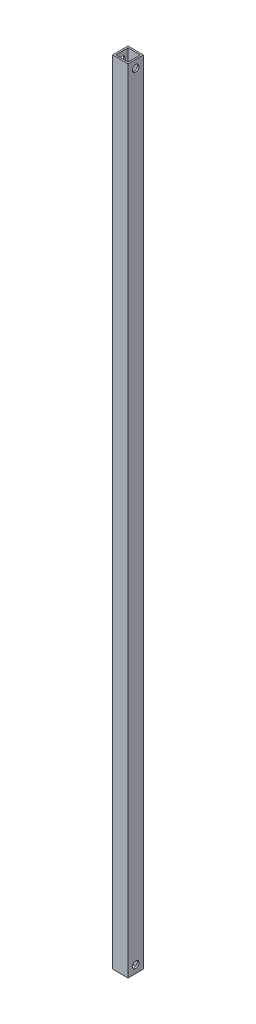
ISO-10303-21;
HEADER;
FILE_DESCRIPTION(('STEP AP214'),'2;1');
FILE_NAME('part.step','',(''),(''),'','','');
FILE_SCHEMA(('AUTOMOTIVE_DESIGN { 1 0 10303 214 1 1 1 1 }'));
ENDSEC;
DATA;
#1=APPLICATION_CONTEXT('core data for automotive mechanical design processes');
#2=APPLICATION_PROTOCOL_DEFINITION('international standard','automotive_design',2000,#1);
#3=PRODUCT_CONTEXT('',#1,'mechanical');
#4=PRODUCT('Part','Part','',(#3));
#5=PRODUCT_RELATED_PRODUCT_CATEGORY('part','',(#4));
#6=PRODUCT_DEFINITION_FORMATION('','',#4);
#7=PRODUCT_DEFINITION_CONTEXT('part definition',#1,'design');
#8=PRODUCT_DEFINITION('design','',#6,#7);
#9=PRODUCT_DEFINITION_SHAPE('','',#8);
#10=(LENGTH_UNIT() NAMED_UNIT(*) SI_UNIT(.MILLI.,.METRE.));
#11=(NAMED_UNIT(*) PLANE_ANGLE_UNIT() SI_UNIT($,.RADIAN.));
#12=(NAMED_UNIT(*) SI_UNIT($,.STERADIAN.) SOLID_ANGLE_UNIT());
#13=UNCERTAINTY_MEASURE_WITH_UNIT(LENGTH_MEASURE(1.E-05),#10,'distance_accuracy_value','');
#14=(GEOMETRIC_REPRESENTATION_CONTEXT(3) GLOBAL_UNCERTAINTY_ASSIGNED_CONTEXT((#13)) GLOBAL_UNIT_ASSIGNED_CONTEXT((#10,
#11,#12)) REPRESENTATION_CONTEXT('',''));
#15=CARTESIAN_POINT('',(0.,0.,0.));
#16=DIRECTION('',(0.,0.,1.));
#17=DIRECTION('',(1.,0.,0.));
#18=AXIS2_PLACEMENT_3D('',#15,#16,#17);
#19=CARTESIAN_POINT('',(0.,513.21590794,0.));
#20=DIRECTION('',(0.,1.,0.));
#21=DIRECTION('',(0.,0.,1.));
#22=AXIS2_PLACEMENT_3D('',#19,#20,#21);
#23=PLANE('',#22);
#24=DIRECTION('',(0.,0.,-1.));
#25=VECTOR('',#24,1.);
#26=CARTESIAN_POINT('',(5.,513.21590794,-5.));
#27=LINE('',#26,#25);
#28=CARTESIAN_POINT('',(5.,513.21590794,5.));
#29=VERTEX_POINT('',#28);
#30=CARTESIAN_POINT('',(5.,513.21590794,-5.));
#31=VERTEX_POINT('',#30);
#32=EDGE_CURVE('E168',#29,#31,#27,.T.);
#33=ORIENTED_EDGE('',*,*,#32,.T.);
#34=DIRECTION('',(-1.,0.,0.));
#35=VECTOR('',#34,1.);
#36=CARTESIAN_POINT('',(-5.,513.21590794,-5.));
#37=LINE('',#36,#35);
#38=CARTESIAN_POINT('',(-5.,513.21590794,-5.));
#39=VERTEX_POINT('',#38);
#40=EDGE_CURVE('E171',#31,#39,#37,.T.);
#41=ORIENTED_EDGE('',*,*,#40,.T.);
#42=DIRECTION('',(0.,0.,1.));
#43=VECTOR('',#42,1.);
#44=CARTESIAN_POINT('',(-5.,513.21590794,-5.));
#45=LINE('',#44,#43);
#46=CARTESIAN_POINT('',(-5.,513.21590794,5.));
#47=VERTEX_POINT('',#46);
#48=EDGE_CURVE('E174',#39,#47,#45,.T.);
#49=ORIENTED_EDGE('',*,*,#48,.T.);
#50=DIRECTION('',(1.,0.,0.));
#51=VECTOR('',#50,1.);
#52=CARTESIAN_POINT('',(-5.,513.21590794,5.));
#53=LINE('',#52,#51);
#54=EDGE_CURVE('E176',#47,#29,#53,.T.);
#55=ORIENTED_EDGE('',*,*,#54,.T.);
#56=EDGE_LOOP('',(#33,#41,#49,#55));
#57=FACE_BOUND('',#56,.T.);
#58=DIRECTION('',(-1.,0.,0.));
#59=VECTOR('',#58,1.);
#60=CARTESIAN_POINT('',(-5.,513.21590794,-4.));
#61=LINE('',#60,#59);
#62=CARTESIAN_POINT('',(4.,513.21590794,-4.));
#63=VERTEX_POINT('',#62);
#64=CARTESIAN_POINT('',(-4.,513.21590794,-4.));
#65=VERTEX_POINT('',#64);
#66=EDGE_CURVE('E138',#63,#65,#61,.T.);
#67=ORIENTED_EDGE('',*,*,#66,.F.);
#68=DIRECTION('',(0.,0.,-1.));
#69=VECTOR('',#68,1.);
#70=CARTESIAN_POINT('',(4.,513.21590794,-5.));
#71=LINE('',#70,#69);
#72=CARTESIAN_POINT('',(4.,513.21590794,4.));
#73=VERTEX_POINT('',#72);
#74=EDGE_CURVE('E130',#73,#63,#71,.T.);
#75=ORIENTED_EDGE('',*,*,#74,.F.);
#76=DIRECTION('',(1.,0.,0.));
#77=VECTOR('',#76,1.);
#78=CARTESIAN_POINT('',(-5.,513.21590794,4.));
#79=LINE('',#78,#77);
#80=CARTESIAN_POINT('',(-4.,513.21590794,4.));
#81=VERTEX_POINT('',#80);
#82=EDGE_CURVE('E152',#81,#73,#79,.T.);
#83=ORIENTED_EDGE('',*,*,#82,.F.);
#84=DIRECTION('',(0.,0.,1.));
#85=VECTOR('',#84,1.);
#86=CARTESIAN_POINT('',(-4.,513.21590794,-5.));
#87=LINE('',#86,#85);
#88=EDGE_CURVE('E150',#65,#81,#87,.T.);
#89=ORIENTED_EDGE('',*,*,#88,.F.);
#90=EDGE_LOOP('',(#67,#75,#83,#89));
#91=FACE_BOUND('',#90,.T.);
#92=ADVANCED_FACE('F63',(#57,#91),#23,.T.);
#93=CARTESIAN_POINT('',(0.,0.,0.));
#94=DIRECTION('',(0.,1.,0.));
#95=DIRECTION('',(0.,0.,1.));
#96=AXIS2_PLACEMENT_3D('',#93,#94,#95);
#97=PLANE('',#96);
#98=DIRECTION('',(0.,0.,-1.));
#99=VECTOR('',#98,1.);
#100=CARTESIAN_POINT('',(5.,0.,-5.));
#101=LINE('',#100,#99);
#102=CARTESIAN_POINT('',(5.,0.,5.));
#103=VERTEX_POINT('',#102);
#104=CARTESIAN_POINT('',(5.,0.,-5.));
#105=VERTEX_POINT('',#104);
#106=EDGE_CURVE('E146',#103,#105,#101,.T.);
#107=ORIENTED_EDGE('',*,*,#106,.F.);
#108=DIRECTION('',(1.,0.,0.));
#109=VECTOR('',#108,1.);
#110=CARTESIAN_POINT('',(-5.,0.,5.));
#111=LINE('',#110,#109);
#112=CARTESIAN_POINT('',(-5.,0.,5.));
#113=VERTEX_POINT('',#112);
#114=EDGE_CURVE('E172',#113,#103,#111,.T.);
#115=ORIENTED_EDGE('',*,*,#114,.F.);
#116=DIRECTION('',(0.,0.,1.));
#117=VECTOR('',#116,1.);
#118=CARTESIAN_POINT('',(-5.,0.,-5.));
#119=LINE('',#118,#117);
#120=CARTESIAN_POINT('',(-5.,0.,-5.));
#121=VERTEX_POINT('',#120);
#122=EDGE_CURVE('E183',#121,#113,#119,.T.);
#123=ORIENTED_EDGE('',*,*,#122,.F.);
#124=DIRECTION('',(-1.,0.,0.));
#125=VECTOR('',#124,1.);
#126=CARTESIAN_POINT('',(-5.,0.,-5.));
#127=LINE('',#126,#125);
#128=EDGE_CURVE('E181',#105,#121,#127,.T.);
#129=ORIENTED_EDGE('',*,*,#128,.F.);
#130=EDGE_LOOP('',(#107,#115,#123,#129));
#131=FACE_BOUND('',#130,.T.);
#132=DIRECTION('',(0.,0.,-1.));
#133=VECTOR('',#132,1.);
#134=CARTESIAN_POINT('',(4.,0.,-5.));
#135=LINE('',#134,#133);
#136=CARTESIAN_POINT('',(4.,0.,4.));
#137=VERTEX_POINT('',#136);
#138=CARTESIAN_POINT('',(4.,0.,-4.));
#139=VERTEX_POINT('',#138);
#140=EDGE_CURVE('E88',#137,#139,#135,.T.);
#141=ORIENTED_EDGE('',*,*,#140,.T.);
#142=DIRECTION('',(-1.,0.,0.));
#143=VECTOR('',#142,1.);
#144=CARTESIAN_POINT('',(-5.,0.,-4.));
#145=LINE('',#144,#143);
#146=CARTESIAN_POINT('',(-4.,0.,-4.));
#147=VERTEX_POINT('',#146);
#148=EDGE_CURVE('E145',#139,#147,#145,.T.);
#149=ORIENTED_EDGE('',*,*,#148,.T.);
#150=DIRECTION('',(0.,0.,1.));
#151=VECTOR('',#150,1.);
#152=CARTESIAN_POINT('',(-4.,0.,-5.));
#153=LINE('',#152,#151);
#154=CARTESIAN_POINT('',(-4.,0.,4.));
#155=VERTEX_POINT('',#154);
#156=EDGE_CURVE('E160',#147,#155,#153,.T.);
#157=ORIENTED_EDGE('',*,*,#156,.T.);
#158=DIRECTION('',(1.,0.,0.));
#159=VECTOR('',#158,1.);
#160=CARTESIAN_POINT('',(-5.,0.,4.));
#161=LINE('',#160,#159);
#162=EDGE_CURVE('E139',#155,#137,#161,.T.);
#163=ORIENTED_EDGE('',*,*,#162,.T.);
#164=EDGE_LOOP('',(#141,#149,#157,#163));
#165=FACE_BOUND('',#164,.T.);
#166=ADVANCED_FACE('F238',(#131,#165),#97,.F.);
#167=CARTESIAN_POINT('',(5.,513.21590794,-5.));
#168=DIRECTION('',(-1.,0.,0.));
#169=DIRECTION('',(0.,0.,1.));
#170=AXIS2_PLACEMENT_3D('',#167,#168,#169);
#171=PLANE('',#170);
#172=CARTESIAN_POINT('',(5.,508.21590794,0.));
#173=DIRECTION('',(-1.,0.,0.));
#174=DIRECTION('',(0.,0.,1.));
#175=AXIS2_PLACEMENT_3D('',#172,#173,#174);
#176=CIRCLE('',#175,2.15000000000003);
#177=CARTESIAN_POINT('',(5.,508.21590794,2.15000000000003));
#178=VERTEX_POINT('',#177);
#179=EDGE_CURVE('E201',#178,#178,#176,.T.);
#180=ORIENTED_EDGE('',*,*,#179,.T.);
#181=EDGE_LOOP('',(#180));
#182=FACE_BOUND('',#181,.T.);
#183=CARTESIAN_POINT('',(5.,5.,0.));
#184=DIRECTION('',(-1.,0.,0.));
#185=DIRECTION('',(0.,0.,-1.));
#186=AXIS2_PLACEMENT_3D('',#183,#184,#185);
#187=CIRCLE('',#186,2.15000000000003);
#188=CARTESIAN_POINT('',(5.,5.,-2.15000000000003));
#189=VERTEX_POINT('',#188);
#190=EDGE_CURVE('E211',#189,#189,#187,.T.);
#191=ORIENTED_EDGE('',*,*,#190,.T.);
#192=EDGE_LOOP('',(#191));
#193=FACE_BOUND('',#192,.T.);
#194=ORIENTED_EDGE('',*,*,#106,.T.);
#195=DIRECTION('',(0.,-1.,0.));
#196=VECTOR('',#195,1.);
#197=CARTESIAN_POINT('',(5.,513.21590794,-5.));
#198=LINE('',#197,#196);
#199=EDGE_CURVE('E12',#31,#105,#198,.T.);
#200=ORIENTED_EDGE('',*,*,#199,.F.);
#201=ORIENTED_EDGE('',*,*,#32,.F.);
#202=DIRECTION('',(0.,-1.,0.));
#203=VECTOR('',#202,1.);
#204=CARTESIAN_POINT('',(5.,513.21590794,5.));
#205=LINE('',#204,#203);
#206=EDGE_CURVE('E178',#29,#103,#205,.T.);
#207=ORIENTED_EDGE('',*,*,#206,.T.);
#208=EDGE_LOOP('',(#194,#200,#201,#207));
#209=FACE_BOUND('',#208,.T.);
#210=ADVANCED_FACE('F65',(#182,#193,#209),#171,.F.);
#211=CARTESIAN_POINT('',(-5.,513.21590794,-5.));
#212=DIRECTION('',(0.,0.,1.));
#213=DIRECTION('',(1.,0.,0.));
#214=AXIS2_PLACEMENT_3D('',#211,#212,#213);
#215=PLANE('',#214);
#216=ORIENTED_EDGE('',*,*,#128,.T.);
#217=DIRECTION('',(0.,-1.,0.));
#218=VECTOR('',#217,1.);
#219=CARTESIAN_POINT('',(-5.,513.21590794,-5.));
#220=LINE('',#219,#218);
#221=EDGE_CURVE('E72',#39,#121,#220,.T.);
#222=ORIENTED_EDGE('',*,*,#221,.F.);
#223=ORIENTED_EDGE('',*,*,#40,.F.);
#224=ORIENTED_EDGE('',*,*,#199,.T.);
#225=EDGE_LOOP('',(#216,#222,#223,#224));
#226=FACE_BOUND('',#225,.T.);
#227=ADVANCED_FACE('F255',(#226),#215,.F.);
#228=CARTESIAN_POINT('',(-5.,513.21590794,-5.));
#229=DIRECTION('',(1.,0.,0.));
#230=DIRECTION('',(0.,0.,-1.));
#231=AXIS2_PLACEMENT_3D('',#228,#229,#230);
#232=PLANE('',#231);
#233=CARTESIAN_POINT('',(-5.,508.21590794,0.));
#234=DIRECTION('',(-1.,0.,0.));
#235=DIRECTION('',(0.,0.,1.));
#236=AXIS2_PLACEMENT_3D('',#233,#234,#235);
#237=CIRCLE('',#236,2.15000000000003);
#238=CARTESIAN_POINT('',(-5.,508.21590794,2.15000000000003));
#239=VERTEX_POINT('',#238);
#240=EDGE_CURVE('E195',#239,#239,#237,.T.);
#241=ORIENTED_EDGE('',*,*,#240,.F.);
#242=EDGE_LOOP('',(#241));
#243=FACE_BOUND('',#242,.T.);
#244=CARTESIAN_POINT('',(-5.,5.,0.));
#245=DIRECTION('',(-1.,0.,0.));
#246=DIRECTION('',(0.,0.,-1.));
#247=AXIS2_PLACEMENT_3D('',#244,#245,#246);
#248=CIRCLE('',#247,2.15000000000003);
#249=CARTESIAN_POINT('',(-5.,5.,-2.15000000000003));
#250=VERTEX_POINT('',#249);
#251=EDGE_CURVE('E206',#250,#250,#248,.T.);
#252=ORIENTED_EDGE('',*,*,#251,.F.);
#253=EDGE_LOOP('',(#252));
#254=FACE_BOUND('',#253,.T.);
#255=ORIENTED_EDGE('',*,*,#122,.T.);
#256=DIRECTION('',(0.,-1.,0.));
#257=VECTOR('',#256,1.);
#258=CARTESIAN_POINT('',(-5.,513.21590794,5.));
#259=LINE('',#258,#257);
#260=EDGE_CURVE('E188',#47,#113,#259,.T.);
#261=ORIENTED_EDGE('',*,*,#260,.F.);
#262=ORIENTED_EDGE('',*,*,#48,.F.);
#263=ORIENTED_EDGE('',*,*,#221,.T.);
#264=EDGE_LOOP('',(#255,#261,#262,#263));
#265=FACE_BOUND('',#264,.T.);
#266=ADVANCED_FACE('F252',(#243,#254,#265),#232,.F.);
#267=CARTESIAN_POINT('',(-5.,513.21590794,5.));
#268=DIRECTION('',(0.,0.,-1.));
#269=DIRECTION('',(-1.,0.,0.));
#270=AXIS2_PLACEMENT_3D('',#267,#268,#269);
#271=PLANE('',#270);
#272=ORIENTED_EDGE('',*,*,#114,.T.);
#273=ORIENTED_EDGE('',*,*,#206,.F.);
#274=ORIENTED_EDGE('',*,*,#54,.F.);
#275=ORIENTED_EDGE('',*,*,#260,.T.);
#276=EDGE_LOOP('',(#272,#273,#274,#275));
#277=FACE_BOUND('',#276,.T.);
#278=ADVANCED_FACE('F249',(#277),#271,.F.);
#279=CARTESIAN_POINT('',(4.,513.21590794,-5.));
#280=DIRECTION('',(-1.,0.,0.));
#281=DIRECTION('',(0.,0.,1.));
#282=AXIS2_PLACEMENT_3D('',#279,#280,#281);
#283=PLANE('',#282);
#284=CARTESIAN_POINT('',(4.,508.21590794,0.));
#285=DIRECTION('',(-1.,0.,0.));
#286=DIRECTION('',(0.,0.,1.));
#287=AXIS2_PLACEMENT_3D('',#284,#285,#286);
#288=CIRCLE('',#287,2.15000000000003);
#289=CARTESIAN_POINT('',(4.,508.21590794,2.15000000000003));
#290=VERTEX_POINT('',#289);
#291=EDGE_CURVE('E158',#290,#290,#288,.F.);
#292=ORIENTED_EDGE('',*,*,#291,.T.);
#293=EDGE_LOOP('',(#292));
#294=FACE_BOUND('',#293,.T.);
#295=CARTESIAN_POINT('',(4.,5.,0.));
#296=DIRECTION('',(-1.,0.,0.));
#297=DIRECTION('',(0.,0.,1.));
#298=AXIS2_PLACEMENT_3D('',#295,#296,#297);
#299=CIRCLE('',#298,2.15000000000003);
#300=CARTESIAN_POINT('',(4.,5.,2.15000000000003));
#301=VERTEX_POINT('',#300);
#302=EDGE_CURVE('E194',#301,#301,#299,.F.);
#303=ORIENTED_EDGE('',*,*,#302,.T.);
#304=EDGE_LOOP('',(#303));
#305=FACE_BOUND('',#304,.T.);
#306=ORIENTED_EDGE('',*,*,#140,.F.);
#307=DIRECTION('',(0.,-1.,0.));
#308=VECTOR('',#307,1.);
#309=CARTESIAN_POINT('',(4.,513.21590794,4.));
#310=LINE('',#309,#308);
#311=EDGE_CURVE('E134',#73,#137,#310,.T.);
#312=ORIENTED_EDGE('',*,*,#311,.F.);
#313=ORIENTED_EDGE('',*,*,#74,.T.);
#314=DIRECTION('',(0.,-1.,0.));
#315=VECTOR('',#314,1.);
#316=CARTESIAN_POINT('',(4.,513.21590794,-4.));
#317=LINE('',#316,#315);
#318=EDGE_CURVE('E133',#63,#139,#317,.T.);
#319=ORIENTED_EDGE('',*,*,#318,.T.);
#320=EDGE_LOOP('',(#306,#312,#313,#319));
#321=FACE_BOUND('',#320,.T.);
#322=ADVANCED_FACE('F132',(#294,#305,#321),#283,.T.);
#323=CARTESIAN_POINT('',(-5.,513.21590794,-4.));
#324=DIRECTION('',(0.,0.,1.));
#325=DIRECTION('',(1.,0.,0.));
#326=AXIS2_PLACEMENT_3D('',#323,#324,#325);
#327=PLANE('',#326);
#328=ORIENTED_EDGE('',*,*,#148,.F.);
#329=ORIENTED_EDGE('',*,*,#318,.F.);
#330=ORIENTED_EDGE('',*,*,#66,.T.);
#331=DIRECTION('',(0.,-1.,0.));
#332=VECTOR('',#331,1.);
#333=CARTESIAN_POINT('',(-4.,513.21590794,-4.));
#334=LINE('',#333,#332);
#335=EDGE_CURVE('E147',#65,#147,#334,.T.);
#336=ORIENTED_EDGE('',*,*,#335,.T.);
#337=EDGE_LOOP('',(#328,#329,#330,#336));
#338=FACE_BOUND('',#337,.T.);
#339=ADVANCED_FACE('F142',(#338),#327,.T.);
#340=CARTESIAN_POINT('',(-4.,513.21590794,-5.));
#341=DIRECTION('',(1.,0.,0.));
#342=DIRECTION('',(0.,0.,-1.));
#343=AXIS2_PLACEMENT_3D('',#340,#341,#342);
#344=PLANE('',#343);
#345=CARTESIAN_POINT('',(-4.,508.21590794,0.));
#346=DIRECTION('',(1.,0.,0.));
#347=DIRECTION('',(0.,0.,-1.));
#348=AXIS2_PLACEMENT_3D('',#345,#346,#347);
#349=CIRCLE('',#348,2.15000000000003);
#350=CARTESIAN_POINT('',(-4.,508.21590794,-2.15000000000003));
#351=VERTEX_POINT('',#350);
#352=EDGE_CURVE('E67',#351,#351,#349,.F.);
#353=ORIENTED_EDGE('',*,*,#352,.T.);
#354=EDGE_LOOP('',(#353));
#355=FACE_BOUND('',#354,.T.);
#356=CARTESIAN_POINT('',(-4.,5.,0.));
#357=DIRECTION('',(1.,0.,0.));
#358=DIRECTION('',(0.,0.,-1.));
#359=AXIS2_PLACEMENT_3D('',#356,#357,#358);
#360=CIRCLE('',#359,2.15000000000003);
#361=CARTESIAN_POINT('',(-4.,5.,-2.15000000000003));
#362=VERTEX_POINT('',#361);
#363=EDGE_CURVE('E192',#362,#362,#360,.F.);
#364=ORIENTED_EDGE('',*,*,#363,.T.);
#365=EDGE_LOOP('',(#364));
#366=FACE_BOUND('',#365,.T.);
#367=ORIENTED_EDGE('',*,*,#156,.F.);
#368=ORIENTED_EDGE('',*,*,#335,.F.);
#369=ORIENTED_EDGE('',*,*,#88,.T.);
#370=DIRECTION('',(0.,-1.,0.));
#371=VECTOR('',#370,1.);
#372=CARTESIAN_POINT('',(-4.,513.21590794,4.));
#373=LINE('',#372,#371);
#374=EDGE_CURVE('E80',#81,#155,#373,.T.);
#375=ORIENTED_EDGE('',*,*,#374,.T.);
#376=EDGE_LOOP('',(#367,#368,#369,#375));
#377=FACE_BOUND('',#376,.T.);
#378=ADVANCED_FACE('F219',(#355,#366,#377),#344,.T.);
#379=CARTESIAN_POINT('',(-5.,513.21590794,4.));
#380=DIRECTION('',(0.,0.,-1.));
#381=DIRECTION('',(-1.,0.,0.));
#382=AXIS2_PLACEMENT_3D('',#379,#380,#381);
#383=PLANE('',#382);
#384=ORIENTED_EDGE('',*,*,#162,.F.);
#385=ORIENTED_EDGE('',*,*,#374,.F.);
#386=ORIENTED_EDGE('',*,*,#82,.T.);
#387=ORIENTED_EDGE('',*,*,#311,.T.);
#388=EDGE_LOOP('',(#384,#385,#386,#387));
#389=FACE_BOUND('',#388,.T.);
#390=ADVANCED_FACE('F233',(#389),#383,.T.);
#391=CARTESIAN_POINT('',(-5.,5.,0.));
#392=DIRECTION('',(1.,0.,0.));
#393=DIRECTION('',(0.,0.,-1.));
#394=AXIS2_PLACEMENT_3D('',#391,#392,#393);
#395=CYLINDRICAL_SURFACE('',#394,2.15000000000003);
#396=ORIENTED_EDGE('',*,*,#363,.F.);
#397=EDGE_LOOP('',(#396));
#398=FACE_BOUND('',#397,.T.);
#399=ORIENTED_EDGE('',*,*,#251,.T.);
#400=EDGE_LOOP('',(#399));
#401=FACE_BOUND('',#400,.T.);
#402=ADVANCED_FACE('F224',(#398,#401),#395,.F.);
#403=CARTESIAN_POINT('',(-5.,508.21590794,0.));
#404=DIRECTION('',(1.,0.,0.));
#405=DIRECTION('',(0.,0.,-1.));
#406=AXIS2_PLACEMENT_3D('',#403,#404,#405);
#407=CYLINDRICAL_SURFACE('',#406,2.15000000000003);
#408=ORIENTED_EDGE('',*,*,#352,.F.);
#409=EDGE_LOOP('',(#408));
#410=FACE_BOUND('',#409,.T.);
#411=ORIENTED_EDGE('',*,*,#240,.T.);
#412=EDGE_LOOP('',(#411));
#413=FACE_BOUND('',#412,.T.);
#414=ADVANCED_FACE('F221',(#410,#413),#407,.F.);
#415=ORIENTED_EDGE('',*,*,#302,.F.);
#416=EDGE_LOOP('',(#415));
#417=FACE_BOUND('',#416,.T.);
#418=ORIENTED_EDGE('',*,*,#190,.F.);
#419=EDGE_LOOP('',(#418));
#420=FACE_BOUND('',#419,.T.);
#421=ADVANCED_FACE('F223',(#417,#420),#395,.F.);
#422=ORIENTED_EDGE('',*,*,#291,.F.);
#423=EDGE_LOOP('',(#422));
#424=FACE_BOUND('',#423,.T.);
#425=ORIENTED_EDGE('',*,*,#179,.F.);
#426=EDGE_LOOP('',(#425));
#427=FACE_BOUND('',#426,.T.);
#428=ADVANCED_FACE('F226',(#424,#427),#407,.F.);
#429=CLOSED_SHELL('',(#92,#166,#210,#227,#266,#278,#322,#339,#378,#390,#402,#414,#421,#428));
#430=MANIFOLD_SOLID_BREP('B2',#429);
#431=ADVANCED_BREP_SHAPE_REPRESENTATION('',(#18,#430),#14);
#432=SHAPE_DEFINITION_REPRESENTATION(#9,#431);
ENDSEC;
END-ISO-10303-21;
